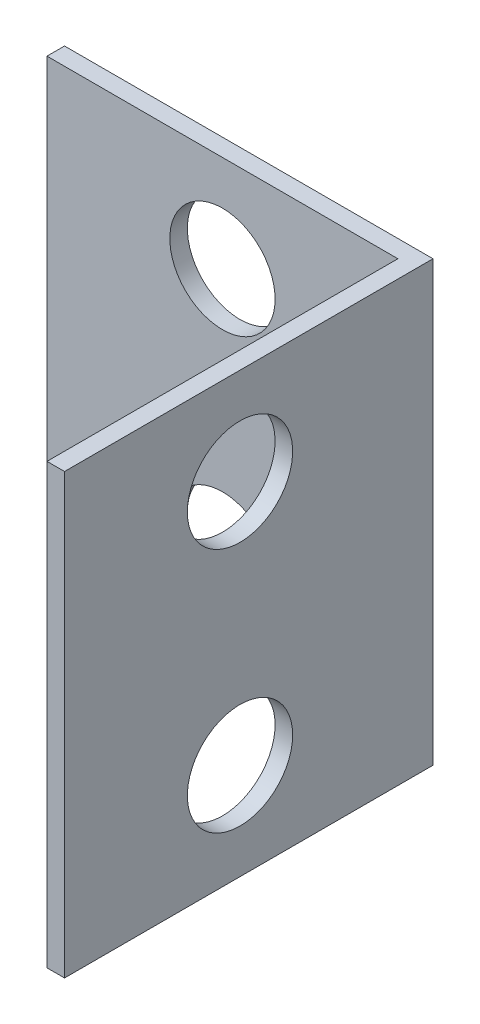
ISO-10303-21;
HEADER;
FILE_DESCRIPTION(('STEP AP214'),'2;1');
FILE_NAME('part.step','',(''),(''),'','','');
FILE_SCHEMA(('AUTOMOTIVE_DESIGN { 1 0 10303 214 1 1 1 1 }'));
ENDSEC;
DATA;
#1=APPLICATION_CONTEXT('core data for automotive mechanical design processes');
#2=APPLICATION_PROTOCOL_DEFINITION('international standard','automotive_design',2000,#1);
#3=PRODUCT_CONTEXT('',#1,'mechanical');
#4=PRODUCT('Part','Part','',(#3));
#5=PRODUCT_RELATED_PRODUCT_CATEGORY('part','',(#4));
#6=PRODUCT_DEFINITION_FORMATION('','',#4);
#7=PRODUCT_DEFINITION_CONTEXT('part definition',#1,'design');
#8=PRODUCT_DEFINITION('design','',#6,#7);
#9=PRODUCT_DEFINITION_SHAPE('','',#8);
#10=(LENGTH_UNIT() NAMED_UNIT(*) SI_UNIT(.MILLI.,.METRE.));
#11=(NAMED_UNIT(*) PLANE_ANGLE_UNIT() SI_UNIT($,.RADIAN.));
#12=(NAMED_UNIT(*) SI_UNIT($,.STERADIAN.) SOLID_ANGLE_UNIT());
#13=UNCERTAINTY_MEASURE_WITH_UNIT(LENGTH_MEASURE(1.E-05),#10,'distance_accuracy_value','');
#14=(GEOMETRIC_REPRESENTATION_CONTEXT(3) GLOBAL_UNCERTAINTY_ASSIGNED_CONTEXT((#13)) GLOBAL_UNIT_ASSIGNED_CONTEXT((#10,
#11,#12)) REPRESENTATION_CONTEXT('',''));
#15=CARTESIAN_POINT('',(0.,0.,0.));
#16=DIRECTION('',(0.,0.,1.));
#17=DIRECTION('',(1.,0.,0.));
#18=AXIS2_PLACEMENT_3D('',#15,#16,#17);
#19=CARTESIAN_POINT('',(-10.,12.5,1.));
#20=DIRECTION('',(0.,-1.,0.));
#21=DIRECTION('',(0.,0.,-1.));
#22=AXIS2_PLACEMENT_3D('',#19,#20,#21);
#23=PLANE('',#22);
#24=DIRECTION('',(-1.,0.,0.));
#25=VECTOR('',#24,1.);
#26=CARTESIAN_POINT('',(-10.,12.5,0.));
#27=LINE('',#26,#25);
#28=CARTESIAN_POINT('',(11.,12.5,0.));
#29=VERTEX_POINT('',#28);
#30=CARTESIAN_POINT('',(-10.,12.5,0.));
#31=VERTEX_POINT('',#30);
#32=EDGE_CURVE('E68',#29,#31,#27,.T.);
#33=ORIENTED_EDGE('',*,*,#32,.T.);
#34=DIRECTION('',(0.,0.,-1.));
#35=VECTOR('',#34,1.);
#36=CARTESIAN_POINT('',(-10.,12.5,1.));
#37=LINE('',#36,#35);
#38=CARTESIAN_POINT('',(-10.,12.5,1.));
#39=VERTEX_POINT('',#38);
#40=EDGE_CURVE('E11',#39,#31,#37,.T.);
#41=ORIENTED_EDGE('',*,*,#40,.F.);
#42=DIRECTION('',(-1.,0.,0.));
#43=VECTOR('',#42,1.);
#44=CARTESIAN_POINT('',(-10.,12.5,1.));
#45=LINE('',#44,#43);
#46=CARTESIAN_POINT('',(10.,12.5,1.));
#47=VERTEX_POINT('',#46);
#48=EDGE_CURVE('E98',#47,#39,#45,.T.);
#49=ORIENTED_EDGE('',*,*,#48,.F.);
#50=DIRECTION('',(0.,0.,1.));
#51=VECTOR('',#50,1.);
#52=CARTESIAN_POINT('',(10.,12.5,0.));
#53=LINE('',#52,#51);
#54=CARTESIAN_POINT('',(10.,12.5,21.));
#55=VERTEX_POINT('',#54);
#56=EDGE_CURVE('E87',#47,#55,#53,.T.);
#57=ORIENTED_EDGE('',*,*,#56,.T.);
#58=DIRECTION('',(-1.,0.,0.));
#59=VECTOR('',#58,1.);
#60=CARTESIAN_POINT('',(11.,12.5,21.));
#61=LINE('',#60,#59);
#62=CARTESIAN_POINT('',(11.,12.5,21.));
#63=VERTEX_POINT('',#62);
#64=EDGE_CURVE('E111',#63,#55,#61,.T.);
#65=ORIENTED_EDGE('',*,*,#64,.F.);
#66=DIRECTION('',(0.,0.,1.));
#67=VECTOR('',#66,1.);
#68=CARTESIAN_POINT('',(11.,12.5,0.));
#69=LINE('',#68,#67);
#70=EDGE_CURVE('E139',#29,#63,#69,.T.);
#71=ORIENTED_EDGE('',*,*,#70,.F.);
#72=EDGE_LOOP('',(#33,#41,#49,#57,#65,#71));
#73=FACE_BOUND('',#72,.T.);
#74=ADVANCED_FACE('F39',(#73),#23,.F.);
#75=CARTESIAN_POINT('',(-10.,-12.5,1.));
#76=DIRECTION('',(1.,0.,0.));
#77=DIRECTION('',(0.,0.,-1.));
#78=AXIS2_PLACEMENT_3D('',#75,#76,#77);
#79=PLANE('',#78);
#80=DIRECTION('',(0.,-1.,0.));
#81=VECTOR('',#80,1.);
#82=CARTESIAN_POINT('',(-10.,-12.5,0.));
#83=LINE('',#82,#81);
#84=CARTESIAN_POINT('',(-10.,-12.5,0.));
#85=VERTEX_POINT('',#84);
#86=EDGE_CURVE('E108',#31,#85,#83,.T.);
#87=ORIENTED_EDGE('',*,*,#86,.T.);
#88=DIRECTION('',(0.,0.,-1.));
#89=VECTOR('',#88,1.);
#90=CARTESIAN_POINT('',(-10.,-12.5,1.));
#91=LINE('',#90,#89);
#92=CARTESIAN_POINT('',(-10.,-12.5,1.));
#93=VERTEX_POINT('',#92);
#94=EDGE_CURVE('E48',#93,#85,#91,.T.);
#95=ORIENTED_EDGE('',*,*,#94,.F.);
#96=DIRECTION('',(0.,-1.,0.));
#97=VECTOR('',#96,1.);
#98=CARTESIAN_POINT('',(-10.,-12.5,1.));
#99=LINE('',#98,#97);
#100=EDGE_CURVE('E56',#39,#93,#99,.T.);
#101=ORIENTED_EDGE('',*,*,#100,.F.);
#102=ORIENTED_EDGE('',*,*,#40,.T.);
#103=EDGE_LOOP('',(#87,#95,#101,#102));
#104=FACE_BOUND('',#103,.T.);
#105=ADVANCED_FACE('F187',(#104),#79,.F.);
#106=CARTESIAN_POINT('',(-10.,-12.5,1.));
#107=DIRECTION('',(0.,1.,0.));
#108=DIRECTION('',(0.,0.,1.));
#109=AXIS2_PLACEMENT_3D('',#106,#107,#108);
#110=PLANE('',#109);
#111=DIRECTION('',(1.,0.,0.));
#112=VECTOR('',#111,1.);
#113=CARTESIAN_POINT('',(-10.,-12.5,0.));
#114=LINE('',#113,#112);
#115=CARTESIAN_POINT('',(11.,-12.5,0.));
#116=VERTEX_POINT('',#115);
#117=EDGE_CURVE('E105',#85,#116,#114,.T.);
#118=ORIENTED_EDGE('',*,*,#117,.T.);
#119=DIRECTION('',(0.,0.,-1.));
#120=VECTOR('',#119,1.);
#121=CARTESIAN_POINT('',(11.,-12.5,0.));
#122=LINE('',#121,#120);
#123=CARTESIAN_POINT('',(11.,-12.5,21.));
#124=VERTEX_POINT('',#123);
#125=EDGE_CURVE('E154',#124,#116,#122,.T.);
#126=ORIENTED_EDGE('',*,*,#125,.F.);
#127=DIRECTION('',(-1.,0.,0.));
#128=VECTOR('',#127,1.);
#129=CARTESIAN_POINT('',(11.,-12.5,21.));
#130=LINE('',#129,#128);
#131=CARTESIAN_POINT('',(10.,-12.5,21.));
#132=VERTEX_POINT('',#131);
#133=EDGE_CURVE('E156',#124,#132,#130,.T.);
#134=ORIENTED_EDGE('',*,*,#133,.T.);
#135=DIRECTION('',(0.,0.,-1.));
#136=VECTOR('',#135,1.);
#137=CARTESIAN_POINT('',(10.,-12.5,0.));
#138=LINE('',#137,#136);
#139=CARTESIAN_POINT('',(10.,-12.5,1.));
#140=VERTEX_POINT('',#139);
#141=EDGE_CURVE('E140',#132,#140,#138,.T.);
#142=ORIENTED_EDGE('',*,*,#141,.T.);
#143=DIRECTION('',(1.,0.,0.));
#144=VECTOR('',#143,1.);
#145=CARTESIAN_POINT('',(-10.,-12.5,1.));
#146=LINE('',#145,#144);
#147=EDGE_CURVE('E103',#93,#140,#146,.T.);
#148=ORIENTED_EDGE('',*,*,#147,.F.);
#149=ORIENTED_EDGE('',*,*,#94,.T.);
#150=EDGE_LOOP('',(#118,#126,#134,#142,#148,#149));
#151=FACE_BOUND('',#150,.T.);
#152=ADVANCED_FACE('F125',(#151),#110,.F.);
#153=CARTESIAN_POINT('',(0.,0.,1.));
#154=DIRECTION('',(0.,0.,-1.));
#155=DIRECTION('',(-1.,0.,0.));
#156=AXIS2_PLACEMENT_3D('',#153,#154,#155);
#157=PLANE('',#156);
#158=CARTESIAN_POINT('',(0.,7.,1.));
#159=DIRECTION('',(0.,0.,1.));
#160=DIRECTION('',(1.,0.,0.));
#161=AXIS2_PLACEMENT_3D('',#158,#159,#160);
#162=CIRCLE('',#161,3.);
#163=CARTESIAN_POINT('',(3.,7.,1.));
#164=VERTEX_POINT('',#163);
#165=EDGE_CURVE('E224',#164,#164,#162,.T.);
#166=ORIENTED_EDGE('',*,*,#165,.F.);
#167=EDGE_LOOP('',(#166));
#168=FACE_BOUND('',#167,.T.);
#169=CARTESIAN_POINT('',(0.,-7.,1.));
#170=DIRECTION('',(0.,0.,1.));
#171=DIRECTION('',(-1.,0.,0.));
#172=AXIS2_PLACEMENT_3D('',#169,#170,#171);
#173=CIRCLE('',#172,3.);
#174=CARTESIAN_POINT('',(-3.,-7.,1.));
#175=VERTEX_POINT('',#174);
#176=EDGE_CURVE('E148',#175,#175,#173,.T.);
#177=ORIENTED_EDGE('',*,*,#176,.F.);
#178=EDGE_LOOP('',(#177));
#179=FACE_BOUND('',#178,.T.);
#180=DIRECTION('',(0.,1.,0.));
#181=VECTOR('',#180,1.);
#182=CARTESIAN_POINT('',(10.,-12.5,1.));
#183=LINE('',#182,#181);
#184=EDGE_CURVE('E77',#140,#47,#183,.T.);
#185=ORIENTED_EDGE('',*,*,#184,.T.);
#186=ORIENTED_EDGE('',*,*,#48,.T.);
#187=ORIENTED_EDGE('',*,*,#100,.T.);
#188=ORIENTED_EDGE('',*,*,#147,.T.);
#189=EDGE_LOOP('',(#185,#186,#187,#188));
#190=FACE_BOUND('',#189,.T.);
#191=ADVANCED_FACE('F101',(#168,#179,#190),#157,.F.);
#192=CARTESIAN_POINT('',(0.,0.,0.));
#193=DIRECTION('',(0.,0.,-1.));
#194=DIRECTION('',(-1.,0.,0.));
#195=AXIS2_PLACEMENT_3D('',#192,#193,#194);
#196=PLANE('',#195);
#197=CARTESIAN_POINT('',(0.,7.,0.));
#198=DIRECTION('',(0.,0.,1.));
#199=DIRECTION('',(1.,0.,0.));
#200=AXIS2_PLACEMENT_3D('',#197,#198,#199);
#201=CIRCLE('',#200,3.);
#202=CARTESIAN_POINT('',(3.,7.,0.));
#203=VERTEX_POINT('',#202);
#204=EDGE_CURVE('E96',#203,#203,#201,.T.);
#205=ORIENTED_EDGE('',*,*,#204,.T.);
#206=EDGE_LOOP('',(#205));
#207=FACE_BOUND('',#206,.T.);
#208=CARTESIAN_POINT('',(0.,-7.,0.));
#209=DIRECTION('',(0.,0.,1.));
#210=DIRECTION('',(-1.,0.,0.));
#211=AXIS2_PLACEMENT_3D('',#208,#209,#210);
#212=CIRCLE('',#211,3.);
#213=CARTESIAN_POINT('',(-3.,-7.,0.));
#214=VERTEX_POINT('',#213);
#215=EDGE_CURVE('E227',#214,#214,#212,.T.);
#216=ORIENTED_EDGE('',*,*,#215,.T.);
#217=EDGE_LOOP('',(#216));
#218=FACE_BOUND('',#217,.T.);
#219=ORIENTED_EDGE('',*,*,#32,.F.);
#220=DIRECTION('',(0.,1.,0.));
#221=VECTOR('',#220,1.);
#222=CARTESIAN_POINT('',(11.,12.5,0.));
#223=LINE('',#222,#221);
#224=EDGE_CURVE('E134',#116,#29,#223,.T.);
#225=ORIENTED_EDGE('',*,*,#224,.F.);
#226=ORIENTED_EDGE('',*,*,#117,.F.);
#227=ORIENTED_EDGE('',*,*,#86,.F.);
#228=EDGE_LOOP('',(#219,#225,#226,#227));
#229=FACE_BOUND('',#228,.T.);
#230=ADVANCED_FACE('F132',(#207,#218,#229),#196,.T.);
#231=CARTESIAN_POINT('',(10.,0.,0.));
#232=DIRECTION('',(-1.,0.,0.));
#233=DIRECTION('',(0.,0.,1.));
#234=AXIS2_PLACEMENT_3D('',#231,#232,#233);
#235=PLANE('',#234);
#236=CARTESIAN_POINT('',(10.,7.,11.));
#237=DIRECTION('',(-1.,0.,0.));
#238=DIRECTION('',(0.,0.,1.));
#239=AXIS2_PLACEMENT_3D('',#236,#237,#238);
#240=CIRCLE('',#239,3.);
#241=CARTESIAN_POINT('',(10.,7.,14.));
#242=VERTEX_POINT('',#241);
#243=EDGE_CURVE('E208',#242,#242,#240,.T.);
#244=ORIENTED_EDGE('',*,*,#243,.F.);
#245=EDGE_LOOP('',(#244));
#246=FACE_BOUND('',#245,.T.);
#247=CARTESIAN_POINT('',(10.,-7.,11.));
#248=DIRECTION('',(-1.,0.,0.));
#249=DIRECTION('',(0.,0.,-1.));
#250=AXIS2_PLACEMENT_3D('',#247,#248,#249);
#251=CIRCLE('',#250,3.);
#252=CARTESIAN_POINT('',(10.,-7.,8.00000000000001));
#253=VERTEX_POINT('',#252);
#254=EDGE_CURVE('E211',#253,#253,#251,.T.);
#255=ORIENTED_EDGE('',*,*,#254,.F.);
#256=EDGE_LOOP('',(#255));
#257=FACE_BOUND('',#256,.T.);
#258=ORIENTED_EDGE('',*,*,#184,.F.);
#259=ORIENTED_EDGE('',*,*,#141,.F.);
#260=DIRECTION('',(0.,-1.,0.));
#261=VECTOR('',#260,1.);
#262=CARTESIAN_POINT('',(10.,12.5,21.));
#263=LINE('',#262,#261);
#264=EDGE_CURVE('E92',#55,#132,#263,.T.);
#265=ORIENTED_EDGE('',*,*,#264,.F.);
#266=ORIENTED_EDGE('',*,*,#56,.F.);
#267=EDGE_LOOP('',(#258,#259,#265,#266));
#268=FACE_BOUND('',#267,.T.);
#269=ADVANCED_FACE('F89',(#246,#257,#268),#235,.T.);
#270=CARTESIAN_POINT('',(11.,12.5,21.));
#271=DIRECTION('',(0.,0.,-1.));
#272=DIRECTION('',(-1.,0.,0.));
#273=AXIS2_PLACEMENT_3D('',#270,#271,#272);
#274=PLANE('',#273);
#275=ORIENTED_EDGE('',*,*,#264,.T.);
#276=ORIENTED_EDGE('',*,*,#133,.F.);
#277=DIRECTION('',(0.,-1.,0.));
#278=VECTOR('',#277,1.);
#279=CARTESIAN_POINT('',(11.,12.5,21.));
#280=LINE('',#279,#278);
#281=EDGE_CURVE('E144',#63,#124,#280,.T.);
#282=ORIENTED_EDGE('',*,*,#281,.F.);
#283=ORIENTED_EDGE('',*,*,#64,.T.);
#284=EDGE_LOOP('',(#275,#276,#282,#283));
#285=FACE_BOUND('',#284,.T.);
#286=ADVANCED_FACE('F165',(#285),#274,.F.);
#287=CARTESIAN_POINT('',(11.,0.,0.));
#288=DIRECTION('',(-1.,0.,0.));
#289=DIRECTION('',(0.,0.,1.));
#290=AXIS2_PLACEMENT_3D('',#287,#288,#289);
#291=PLANE('',#290);
#292=CARTESIAN_POINT('',(11.,7.,11.));
#293=DIRECTION('',(-1.,0.,0.));
#294=DIRECTION('',(0.,0.,1.));
#295=AXIS2_PLACEMENT_3D('',#292,#293,#294);
#296=CIRCLE('',#295,3.);
#297=CARTESIAN_POINT('',(11.,7.,14.));
#298=VERTEX_POINT('',#297);
#299=EDGE_CURVE('E234',#298,#298,#296,.T.);
#300=ORIENTED_EDGE('',*,*,#299,.T.);
#301=EDGE_LOOP('',(#300));
#302=FACE_BOUND('',#301,.T.);
#303=CARTESIAN_POINT('',(11.,-7.,11.));
#304=DIRECTION('',(-1.,0.,0.));
#305=DIRECTION('',(0.,0.,-1.));
#306=AXIS2_PLACEMENT_3D('',#303,#304,#305);
#307=CIRCLE('',#306,3.);
#308=CARTESIAN_POINT('',(11.,-7.,8.00000000000001));
#309=VERTEX_POINT('',#308);
#310=EDGE_CURVE('E214',#309,#309,#307,.T.);
#311=ORIENTED_EDGE('',*,*,#310,.T.);
#312=EDGE_LOOP('',(#311));
#313=FACE_BOUND('',#312,.T.);
#314=ORIENTED_EDGE('',*,*,#224,.T.);
#315=ORIENTED_EDGE('',*,*,#70,.T.);
#316=ORIENTED_EDGE('',*,*,#281,.T.);
#317=ORIENTED_EDGE('',*,*,#125,.T.);
#318=EDGE_LOOP('',(#314,#315,#316,#317));
#319=FACE_BOUND('',#318,.T.);
#320=ADVANCED_FACE('F170',(#302,#313,#319),#291,.F.);
#321=CARTESIAN_POINT('',(0.,-7.,0.));
#322=DIRECTION('',(0.,0.,1.));
#323=DIRECTION('',(1.,0.,0.));
#324=AXIS2_PLACEMENT_3D('',#321,#322,#323);
#325=CYLINDRICAL_SURFACE('',#324,3.);
#326=ORIENTED_EDGE('',*,*,#215,.F.);
#327=EDGE_LOOP('',(#326));
#328=FACE_BOUND('',#327,.T.);
#329=ORIENTED_EDGE('',*,*,#176,.T.);
#330=EDGE_LOOP('',(#329));
#331=FACE_BOUND('',#330,.T.);
#332=ADVANCED_FACE('F172',(#328,#331),#325,.F.);
#333=CARTESIAN_POINT('',(0.,7.,0.));
#334=DIRECTION('',(0.,0.,1.));
#335=DIRECTION('',(1.,0.,0.));
#336=AXIS2_PLACEMENT_3D('',#333,#334,#335);
#337=CYLINDRICAL_SURFACE('',#336,3.);
#338=ORIENTED_EDGE('',*,*,#204,.F.);
#339=EDGE_LOOP('',(#338));
#340=FACE_BOUND('',#339,.T.);
#341=ORIENTED_EDGE('',*,*,#165,.T.);
#342=EDGE_LOOP('',(#341));
#343=FACE_BOUND('',#342,.T.);
#344=ADVANCED_FACE('F179',(#340,#343),#337,.F.);
#345=CARTESIAN_POINT('',(11.,-7.,11.));
#346=DIRECTION('',(-1.,0.,0.));
#347=DIRECTION('',(0.,0.,1.));
#348=AXIS2_PLACEMENT_3D('',#345,#346,#347);
#349=CYLINDRICAL_SURFACE('',#348,3.);
#350=ORIENTED_EDGE('',*,*,#310,.F.);
#351=EDGE_LOOP('',(#350));
#352=FACE_BOUND('',#351,.T.);
#353=ORIENTED_EDGE('',*,*,#254,.T.);
#354=EDGE_LOOP('',(#353));
#355=FACE_BOUND('',#354,.T.);
#356=ADVANCED_FACE('F244',(#352,#355),#349,.F.);
#357=CARTESIAN_POINT('',(11.,7.,11.));
#358=DIRECTION('',(-1.,0.,0.));
#359=DIRECTION('',(0.,0.,1.));
#360=AXIS2_PLACEMENT_3D('',#357,#358,#359);
#361=CYLINDRICAL_SURFACE('',#360,3.);
#362=ORIENTED_EDGE('',*,*,#299,.F.);
#363=EDGE_LOOP('',(#362));
#364=FACE_BOUND('',#363,.T.);
#365=ORIENTED_EDGE('',*,*,#243,.T.);
#366=EDGE_LOOP('',(#365));
#367=FACE_BOUND('',#366,.T.);
#368=ADVANCED_FACE('F242',(#364,#367),#361,.F.);
#369=CLOSED_SHELL('',(#74,#105,#152,#191,#230,#269,#286,#320,#332,#344,#356,#368));
#370=MANIFOLD_SOLID_BREP('B2',#369);
#371=ADVANCED_BREP_SHAPE_REPRESENTATION('',(#18,#370),#14);
#372=SHAPE_DEFINITION_REPRESENTATION(#9,#371);
ENDSEC;
END-ISO-10303-21;
